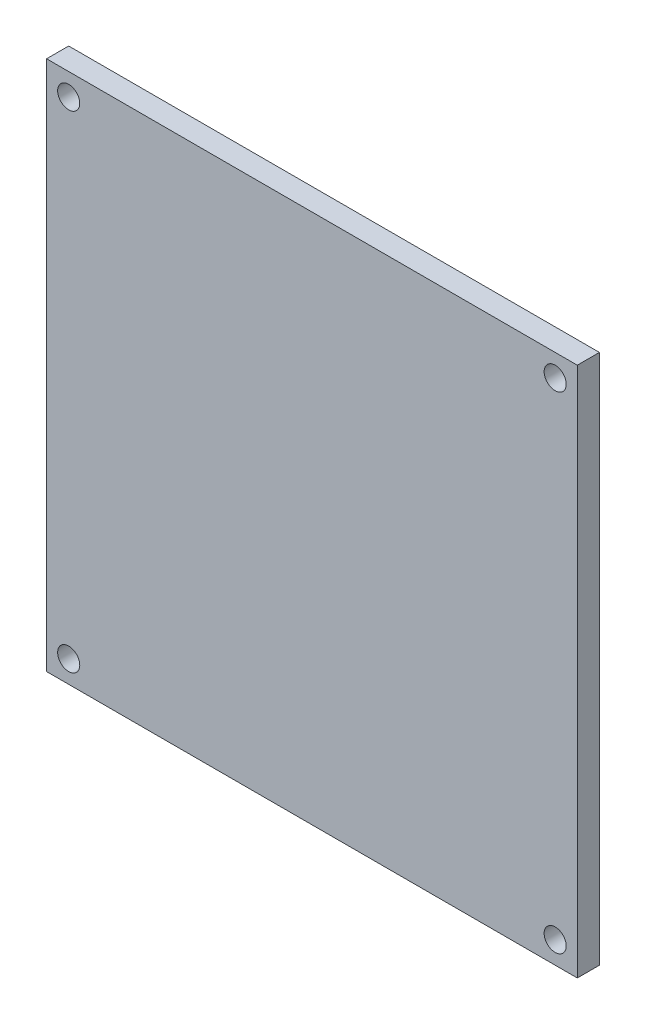
ISO-10303-21;
HEADER;
FILE_DESCRIPTION(('STEP AP214'),'2;1');
FILE_NAME('part.step','',(''),(''),'','','');
FILE_SCHEMA(('AUTOMOTIVE_DESIGN { 1 0 10303 214 1 1 1 1 }'));
ENDSEC;
DATA;
#1=APPLICATION_CONTEXT('core data for automotive mechanical design processes');
#2=APPLICATION_PROTOCOL_DEFINITION('international standard','automotive_design',2000,#1);
#3=PRODUCT_CONTEXT('',#1,'mechanical');
#4=PRODUCT('Part','Part','',(#3));
#5=PRODUCT_RELATED_PRODUCT_CATEGORY('part','',(#4));
#6=PRODUCT_DEFINITION_FORMATION('','',#4);
#7=PRODUCT_DEFINITION_CONTEXT('part definition',#1,'design');
#8=PRODUCT_DEFINITION('design','',#6,#7);
#9=PRODUCT_DEFINITION_SHAPE('','',#8);
#10=(LENGTH_UNIT() NAMED_UNIT(*) SI_UNIT(.MILLI.,.METRE.));
#11=(NAMED_UNIT(*) PLANE_ANGLE_UNIT() SI_UNIT($,.RADIAN.));
#12=(NAMED_UNIT(*) SI_UNIT($,.STERADIAN.) SOLID_ANGLE_UNIT());
#13=UNCERTAINTY_MEASURE_WITH_UNIT(LENGTH_MEASURE(1.E-05),#10,'distance_accuracy_value','');
#14=(GEOMETRIC_REPRESENTATION_CONTEXT(3) GLOBAL_UNCERTAINTY_ASSIGNED_CONTEXT((#13)) GLOBAL_UNIT_ASSIGNED_CONTEXT((#10,
#11,#12)) REPRESENTATION_CONTEXT('',''));
#15=CARTESIAN_POINT('',(0.,0.,0.));
#16=DIRECTION('',(0.,0.,1.));
#17=DIRECTION('',(1.,0.,0.));
#18=AXIS2_PLACEMENT_3D('',#15,#16,#17);
#19=CARTESIAN_POINT('',(-405.309286775553,1958.34628023542,-234.999999999999));
#20=DIRECTION('',(0.,0.,1.));
#21=DIRECTION('',(0.,-1.,0.));
#22=AXIS2_PLACEMENT_3D('',#19,#20,#21);
#23=PLANE('',#22);
#24=CARTESIAN_POINT('',(-290.309286775553,2073.34628023542,-235.));
#25=DIRECTION('',(0.,0.,1.));
#26=DIRECTION('',(0.,-1.,0.));
#27=AXIS2_PLACEMENT_3D('',#24,#25,#26);
#28=CIRCLE('',#27,2.5);
#29=CARTESIAN_POINT('',(-290.309286775553,2070.84628023542,-235.));
#30=VERTEX_POINT('',#29);
#31=EDGE_CURVE('E42',#30,#30,#28,.T.);
#32=ORIENTED_EDGE('',*,*,#31,.F.);
#33=EDGE_LOOP('',(#32));
#34=FACE_BOUND('',#33,.T.);
#35=CARTESIAN_POINT('',(-290.309286775553,1963.34628023542,-234.999999999999));
#36=DIRECTION('',(0.,0.,1.));
#37=DIRECTION('',(0.,-1.,0.));
#38=AXIS2_PLACEMENT_3D('',#35,#36,#37);
#39=CIRCLE('',#38,2.5);
#40=CARTESIAN_POINT('',(-290.309286775553,1960.84628023542,-234.999999999999));
#41=VERTEX_POINT('',#40);
#42=EDGE_CURVE('E114',#41,#41,#39,.T.);
#43=ORIENTED_EDGE('',*,*,#42,.F.);
#44=EDGE_LOOP('',(#43));
#45=FACE_BOUND('',#44,.T.);
#46=CARTESIAN_POINT('',(-400.309286775553,1963.34628023542,-234.999999999999));
#47=DIRECTION('',(0.,0.,1.));
#48=DIRECTION('',(0.,-1.,0.));
#49=AXIS2_PLACEMENT_3D('',#46,#47,#48);
#50=CIRCLE('',#49,2.5);
#51=CARTESIAN_POINT('',(-400.309286775553,1960.84628023542,-234.999999999999));
#52=VERTEX_POINT('',#51);
#53=EDGE_CURVE('E110',#52,#52,#50,.T.);
#54=ORIENTED_EDGE('',*,*,#53,.F.);
#55=EDGE_LOOP('',(#54));
#56=FACE_BOUND('',#55,.T.);
#57=CARTESIAN_POINT('',(-400.309286775553,2073.34628023542,-234.999999999999));
#58=DIRECTION('',(0.,0.,1.));
#59=DIRECTION('',(0.,-1.,0.));
#60=AXIS2_PLACEMENT_3D('',#57,#58,#59);
#61=CIRCLE('',#60,2.5);
#62=CARTESIAN_POINT('',(-400.309286775553,2070.84628023542,-234.999999999999));
#63=VERTEX_POINT('',#62);
#64=EDGE_CURVE('E102',#63,#63,#61,.T.);
#65=ORIENTED_EDGE('',*,*,#64,.F.);
#66=EDGE_LOOP('',(#65));
#67=FACE_BOUND('',#66,.T.);
#68=DIRECTION('',(0.,1.,0.));
#69=VECTOR('',#68,1.);
#70=CARTESIAN_POINT('',(-405.309286775553,1958.34628023542,-234.999999999999));
#71=LINE('',#70,#69);
#72=CARTESIAN_POINT('',(-405.309286775553,1958.34628023542,-234.999999999999));
#73=VERTEX_POINT('',#72);
#74=CARTESIAN_POINT('',(-405.309286775553,2078.34628023542,-234.999999999999));
#75=VERTEX_POINT('',#74);
#76=EDGE_CURVE('E94',#73,#75,#71,.T.);
#77=ORIENTED_EDGE('',*,*,#76,.F.);
#78=DIRECTION('',(-1.,0.,0.));
#79=VECTOR('',#78,1.);
#80=CARTESIAN_POINT('',(-285.309286775553,1958.34628023542,-234.999999999999));
#81=LINE('',#80,#79);
#82=CARTESIAN_POINT('',(-285.309286775553,1958.34628023542,-234.999999999999));
#83=VERTEX_POINT('',#82);
#84=EDGE_CURVE('E76',#83,#73,#81,.T.);
#85=ORIENTED_EDGE('',*,*,#84,.F.);
#86=DIRECTION('',(0.,-1.,0.));
#87=VECTOR('',#86,1.);
#88=CARTESIAN_POINT('',(-285.309286775553,1958.34628023542,-234.999999999999));
#89=LINE('',#88,#87);
#90=CARTESIAN_POINT('',(-285.309286775553,2078.34628023542,-235.));
#91=VERTEX_POINT('',#90);
#92=EDGE_CURVE('E82',#91,#83,#89,.T.);
#93=ORIENTED_EDGE('',*,*,#92,.F.);
#94=DIRECTION('',(1.,0.,0.));
#95=VECTOR('',#94,1.);
#96=CARTESIAN_POINT('',(-285.309286775553,2078.34628023542,-235.));
#97=LINE('',#96,#95);
#98=EDGE_CURVE('E50',#75,#91,#97,.T.);
#99=ORIENTED_EDGE('',*,*,#98,.F.);
#100=EDGE_LOOP('',(#77,#85,#93,#99));
#101=FACE_BOUND('',#100,.T.);
#102=ADVANCED_FACE('F34',(#34,#45,#56,#67,#101),#23,.T.);
#103=CARTESIAN_POINT('',(-285.309286775553,1958.34628023542,-239.999999999999));
#104=DIRECTION('',(0.,1.,0.));
#105=DIRECTION('',(0.,0.,1.));
#106=AXIS2_PLACEMENT_3D('',#103,#104,#105);
#107=PLANE('',#106);
#108=ORIENTED_EDGE('',*,*,#84,.T.);
#109=DIRECTION('',(0.,0.,1.));
#110=VECTOR('',#109,1.);
#111=CARTESIAN_POINT('',(-405.309286775553,1958.34628023542,-239.999999999999));
#112=LINE('',#111,#110);
#113=CARTESIAN_POINT('',(-405.309286775553,1958.34628023542,-239.999999999999));
#114=VERTEX_POINT('',#113);
#115=EDGE_CURVE('E91',#114,#73,#112,.T.);
#116=ORIENTED_EDGE('',*,*,#115,.F.);
#117=DIRECTION('',(-1.,0.,0.));
#118=VECTOR('',#117,1.);
#119=CARTESIAN_POINT('',(-285.309286775553,1958.34628023542,-239.999999999999));
#120=LINE('',#119,#118);
#121=CARTESIAN_POINT('',(-285.309286775553,1958.34628023542,-239.999999999999));
#122=VERTEX_POINT('',#121);
#123=EDGE_CURVE('E90',#122,#114,#120,.T.);
#124=ORIENTED_EDGE('',*,*,#123,.F.);
#125=DIRECTION('',(0.,0.,1.));
#126=VECTOR('',#125,1.);
#127=CARTESIAN_POINT('',(-285.309286775553,1958.34628023542,-239.999999999999));
#128=LINE('',#127,#126);
#129=EDGE_CURVE('E85',#122,#83,#128,.T.);
#130=ORIENTED_EDGE('',*,*,#129,.T.);
#131=EDGE_LOOP('',(#108,#116,#124,#130));
#132=FACE_BOUND('',#131,.T.);
#133=ADVANCED_FACE('F89',(#132),#107,.F.);
#134=CARTESIAN_POINT('',(-405.309286775553,1958.34628023542,-239.999999999999));
#135=DIRECTION('',(1.,0.,0.));
#136=DIRECTION('',(0.,0.,-1.));
#137=AXIS2_PLACEMENT_3D('',#134,#135,#136);
#138=PLANE('',#137);
#139=ORIENTED_EDGE('',*,*,#76,.T.);
#140=DIRECTION('',(0.,0.,1.));
#141=VECTOR('',#140,1.);
#142=CARTESIAN_POINT('',(-405.309286775553,2078.34628023542,-239.999999999999));
#143=LINE('',#142,#141);
#144=CARTESIAN_POINT('',(-405.309286775553,2078.34628023542,-239.999999999999));
#145=VERTEX_POINT('',#144);
#146=EDGE_CURVE('E129',#145,#75,#143,.T.);
#147=ORIENTED_EDGE('',*,*,#146,.F.);
#148=DIRECTION('',(0.,1.,0.));
#149=VECTOR('',#148,1.);
#150=CARTESIAN_POINT('',(-405.309286775553,1958.34628023542,-239.999999999999));
#151=LINE('',#150,#149);
#152=EDGE_CURVE('E95',#114,#145,#151,.T.);
#153=ORIENTED_EDGE('',*,*,#152,.F.);
#154=ORIENTED_EDGE('',*,*,#115,.T.);
#155=EDGE_LOOP('',(#139,#147,#153,#154));
#156=FACE_BOUND('',#155,.T.);
#157=ADVANCED_FACE('F135',(#156),#138,.F.);
#158=CARTESIAN_POINT('',(-1.11762451145597E-13,-3.88670577204184E-13,-239.999999999996));
#159=DIRECTION('',(0.,0.,1.));
#160=DIRECTION('',(0.,-1.,0.));
#161=AXIS2_PLACEMENT_3D('',#158,#159,#160);
#162=PLANE('',#161);
#163=CARTESIAN_POINT('',(-290.309286775553,2073.34628023542,-240.));
#164=DIRECTION('',(0.,0.,-1.));
#165=DIRECTION('',(0.,1.,0.));
#166=AXIS2_PLACEMENT_3D('',#163,#164,#165);
#167=CIRCLE('',#166,2.5);
#168=CARTESIAN_POINT('',(-290.309286775553,2075.84628023542,-240.));
#169=VERTEX_POINT('',#168);
#170=EDGE_CURVE('E11',#169,#169,#167,.T.);
#171=ORIENTED_EDGE('',*,*,#170,.F.);
#172=EDGE_LOOP('',(#171));
#173=FACE_BOUND('',#172,.T.);
#174=CARTESIAN_POINT('',(-290.309286775553,1963.34628023542,-239.999999999999));
#175=DIRECTION('',(0.,0.,-1.));
#176=DIRECTION('',(0.,1.,0.));
#177=AXIS2_PLACEMENT_3D('',#174,#175,#176);
#178=CIRCLE('',#177,2.5);
#179=CARTESIAN_POINT('',(-290.309286775553,1965.84628023542,-239.999999999999));
#180=VERTEX_POINT('',#179);
#181=EDGE_CURVE('E116',#180,#180,#178,.T.);
#182=ORIENTED_EDGE('',*,*,#181,.F.);
#183=EDGE_LOOP('',(#182));
#184=FACE_BOUND('',#183,.T.);
#185=CARTESIAN_POINT('',(-400.309286775553,1963.34628023542,-239.999999999999));
#186=DIRECTION('',(0.,0.,-1.));
#187=DIRECTION('',(0.,1.,0.));
#188=AXIS2_PLACEMENT_3D('',#185,#186,#187);
#189=CIRCLE('',#188,2.5);
#190=CARTESIAN_POINT('',(-400.309286775553,1965.84628023542,-239.999999999999));
#191=VERTEX_POINT('',#190);
#192=EDGE_CURVE('E111',#191,#191,#189,.T.);
#193=ORIENTED_EDGE('',*,*,#192,.F.);
#194=EDGE_LOOP('',(#193));
#195=FACE_BOUND('',#194,.T.);
#196=CARTESIAN_POINT('',(-400.309286775553,2073.34628023542,-239.999999999999));
#197=DIRECTION('',(0.,0.,-1.));
#198=DIRECTION('',(0.,1.,0.));
#199=AXIS2_PLACEMENT_3D('',#196,#197,#198);
#200=CIRCLE('',#199,2.5);
#201=CARTESIAN_POINT('',(-400.309286775553,2075.84628023542,-239.999999999999));
#202=VERTEX_POINT('',#201);
#203=EDGE_CURVE('E107',#202,#202,#200,.T.);
#204=ORIENTED_EDGE('',*,*,#203,.F.);
#205=EDGE_LOOP('',(#204));
#206=FACE_BOUND('',#205,.T.);
#207=ORIENTED_EDGE('',*,*,#152,.T.);
#208=DIRECTION('',(1.,0.,0.));
#209=VECTOR('',#208,1.);
#210=CARTESIAN_POINT('',(-285.309286775553,2078.34628023542,-240.));
#211=LINE('',#210,#209);
#212=CARTESIAN_POINT('',(-285.309286775553,2078.34628023542,-240.));
#213=VERTEX_POINT('',#212);
#214=EDGE_CURVE('E66',#145,#213,#211,.T.);
#215=ORIENTED_EDGE('',*,*,#214,.T.);
#216=DIRECTION('',(0.,-1.,0.));
#217=VECTOR('',#216,1.);
#218=CARTESIAN_POINT('',(-285.309286775553,1958.34628023542,-239.999999999999));
#219=LINE('',#218,#217);
#220=EDGE_CURVE('E104',#213,#122,#219,.T.);
#221=ORIENTED_EDGE('',*,*,#220,.T.);
#222=ORIENTED_EDGE('',*,*,#123,.T.);
#223=EDGE_LOOP('',(#207,#215,#221,#222));
#224=FACE_BOUND('',#223,.T.);
#225=ADVANCED_FACE('F136',(#173,#184,#195,#206,#224),#162,.F.);
#226=CARTESIAN_POINT('',(-290.309286775553,2073.34628023542,-240.));
#227=DIRECTION('',(0.,0.,-1.));
#228=DIRECTION('',(0.,1.,0.));
#229=AXIS2_PLACEMENT_3D('',#226,#227,#228);
#230=CYLINDRICAL_SURFACE('',#229,2.5);
#231=ORIENTED_EDGE('',*,*,#31,.T.);
#232=EDGE_LOOP('',(#231));
#233=FACE_BOUND('',#232,.T.);
#234=ORIENTED_EDGE('',*,*,#170,.T.);
#235=EDGE_LOOP('',(#234));
#236=FACE_BOUND('',#235,.T.);
#237=ADVANCED_FACE('F138',(#233,#236),#230,.F.);
#238=CARTESIAN_POINT('',(-290.309286775553,1963.34628023542,-239.999999999999));
#239=DIRECTION('',(0.,0.,-1.));
#240=DIRECTION('',(0.,1.,0.));
#241=AXIS2_PLACEMENT_3D('',#238,#239,#240);
#242=CYLINDRICAL_SURFACE('',#241,2.5);
#243=ORIENTED_EDGE('',*,*,#42,.T.);
#244=EDGE_LOOP('',(#243));
#245=FACE_BOUND('',#244,.T.);
#246=ORIENTED_EDGE('',*,*,#181,.T.);
#247=EDGE_LOOP('',(#246));
#248=FACE_BOUND('',#247,.T.);
#249=ADVANCED_FACE('F145',(#245,#248),#242,.F.);
#250=CARTESIAN_POINT('',(-400.309286775553,1963.34628023542,-239.999999999999));
#251=DIRECTION('',(0.,0.,-1.));
#252=DIRECTION('',(0.,1.,0.));
#253=AXIS2_PLACEMENT_3D('',#250,#251,#252);
#254=CYLINDRICAL_SURFACE('',#253,2.5);
#255=ORIENTED_EDGE('',*,*,#53,.T.);
#256=EDGE_LOOP('',(#255));
#257=FACE_BOUND('',#256,.T.);
#258=ORIENTED_EDGE('',*,*,#192,.T.);
#259=EDGE_LOOP('',(#258));
#260=FACE_BOUND('',#259,.T.);
#261=ADVANCED_FACE('F173',(#257,#260),#254,.F.);
#262=CARTESIAN_POINT('',(-400.309286775553,2073.34628023542,-239.999999999999));
#263=DIRECTION('',(0.,0.,-1.));
#264=DIRECTION('',(0.,1.,0.));
#265=AXIS2_PLACEMENT_3D('',#262,#263,#264);
#266=CYLINDRICAL_SURFACE('',#265,2.5);
#267=ORIENTED_EDGE('',*,*,#64,.T.);
#268=EDGE_LOOP('',(#267));
#269=FACE_BOUND('',#268,.T.);
#270=ORIENTED_EDGE('',*,*,#203,.T.);
#271=EDGE_LOOP('',(#270));
#272=FACE_BOUND('',#271,.T.);
#273=ADVANCED_FACE('F159',(#269,#272),#266,.F.);
#274=CARTESIAN_POINT('',(-285.309286775553,1958.34628023542,-239.999999999999));
#275=DIRECTION('',(-1.,0.,0.));
#276=DIRECTION('',(0.,0.,1.));
#277=AXIS2_PLACEMENT_3D('',#274,#275,#276);
#278=PLANE('',#277);
#279=ORIENTED_EDGE('',*,*,#92,.T.);
#280=ORIENTED_EDGE('',*,*,#129,.F.);
#281=ORIENTED_EDGE('',*,*,#220,.F.);
#282=DIRECTION('',(0.,0.,1.));
#283=VECTOR('',#282,1.);
#284=CARTESIAN_POINT('',(-285.309286775553,2078.34628023542,-240.));
#285=LINE('',#284,#283);
#286=EDGE_CURVE('E87',#213,#91,#285,.T.);
#287=ORIENTED_EDGE('',*,*,#286,.T.);
#288=EDGE_LOOP('',(#279,#280,#281,#287));
#289=FACE_BOUND('',#288,.T.);
#290=ADVANCED_FACE('F83',(#289),#278,.F.);
#291=CARTESIAN_POINT('',(-285.309286775553,2078.34628023542,-240.));
#292=DIRECTION('',(0.,-1.,0.));
#293=DIRECTION('',(0.,0.,-1.));
#294=AXIS2_PLACEMENT_3D('',#291,#292,#293);
#295=PLANE('',#294);
#296=ORIENTED_EDGE('',*,*,#98,.T.);
#297=ORIENTED_EDGE('',*,*,#286,.F.);
#298=ORIENTED_EDGE('',*,*,#214,.F.);
#299=ORIENTED_EDGE('',*,*,#146,.T.);
#300=EDGE_LOOP('',(#296,#297,#298,#299));
#301=FACE_BOUND('',#300,.T.);
#302=ADVANCED_FACE('F132',(#301),#295,.F.);
#303=CLOSED_SHELL('',(#102,#133,#157,#225,#237,#249,#261,#273,#290,#302));
#304=MANIFOLD_SOLID_BREP('B2',#303);
#305=ADVANCED_BREP_SHAPE_REPRESENTATION('',(#18,#304),#14);
#306=SHAPE_DEFINITION_REPRESENTATION(#9,#305);
ENDSEC;
END-ISO-10303-21;
